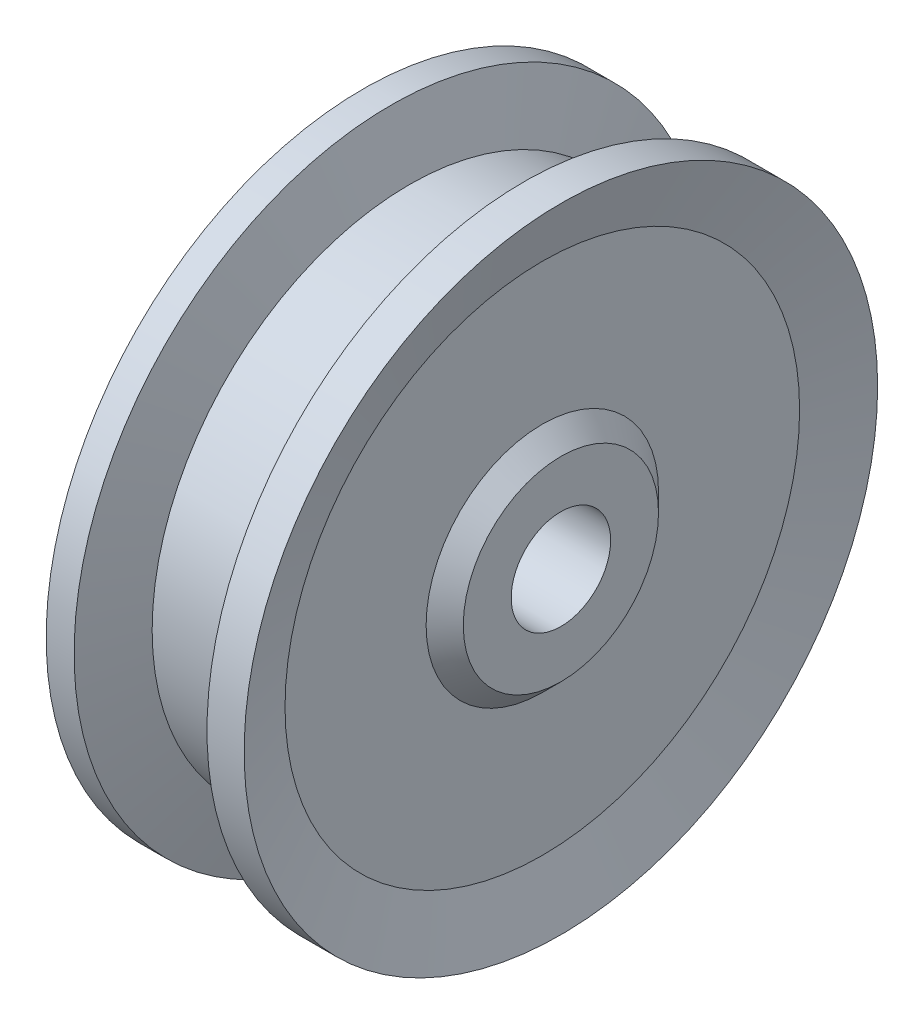
ISO-10303-21;
HEADER;
FILE_DESCRIPTION(('STEP AP214'),'2;1');
FILE_NAME('part.step','',(''),(''),'','','');
FILE_SCHEMA(('AUTOMOTIVE_DESIGN { 1 0 10303 214 1 1 1 1 }'));
ENDSEC;
DATA;
#1=APPLICATION_CONTEXT('core data for automotive mechanical design processes');
#2=APPLICATION_PROTOCOL_DEFINITION('international standard','automotive_design',2000,#1);
#3=PRODUCT_CONTEXT('',#1,'mechanical');
#4=PRODUCT('Part','Part','',(#3));
#5=PRODUCT_RELATED_PRODUCT_CATEGORY('part','',(#4));
#6=PRODUCT_DEFINITION_FORMATION('','',#4);
#7=PRODUCT_DEFINITION_CONTEXT('part definition',#1,'design');
#8=PRODUCT_DEFINITION('design','',#6,#7);
#9=PRODUCT_DEFINITION_SHAPE('','',#8);
#10=(LENGTH_UNIT() NAMED_UNIT(*) SI_UNIT(.MILLI.,.METRE.));
#11=(NAMED_UNIT(*) PLANE_ANGLE_UNIT() SI_UNIT($,.RADIAN.));
#12=(NAMED_UNIT(*) SI_UNIT($,.STERADIAN.) SOLID_ANGLE_UNIT());
#13=UNCERTAINTY_MEASURE_WITH_UNIT(LENGTH_MEASURE(1.E-05),#10,'distance_accuracy_value','');
#14=(GEOMETRIC_REPRESENTATION_CONTEXT(3) GLOBAL_UNCERTAINTY_ASSIGNED_CONTEXT((#13)) GLOBAL_UNIT_ASSIGNED_CONTEXT((#10,
#11,#12)) REPRESENTATION_CONTEXT('',''));
#15=CARTESIAN_POINT('',(0.,0.,0.));
#16=DIRECTION('',(0.,0.,1.));
#17=DIRECTION('',(1.,0.,0.));
#18=AXIS2_PLACEMENT_3D('',#15,#16,#17);
#19=CARTESIAN_POINT('',(57.6768489049945,0.,0.));
#20=DIRECTION('',(1.,0.,0.));
#21=DIRECTION('',(0.,0.,-1.));
#22=AXIS2_PLACEMENT_3D('',#19,#20,#21);
#23=CYLINDRICAL_SURFACE('',#22,40.);
#24=CARTESIAN_POINT('',(7.80674745351395,0.,0.));
#25=DIRECTION('',(1.,0.,0.));
#26=DIRECTION('',(0.,0.,-1.));
#27=AXIS2_PLACEMENT_3D('',#24,#25,#26);
#28=CIRCLE('',#27,40.);
#29=CARTESIAN_POINT('',(7.80674745351395,0.,-40.));
#30=VERTEX_POINT('',#29);
#31=EDGE_CURVE('E10',#30,#30,#28,.T.);
#32=ORIENTED_EDGE('',*,*,#31,.T.);
#33=EDGE_LOOP('',(#32));
#34=FACE_BOUND('',#33,.T.);
#35=CARTESIAN_POINT('',(12.5,0.,0.));
#36=DIRECTION('',(1.,0.,0.));
#37=DIRECTION('',(0.,0.,-1.));
#38=AXIS2_PLACEMENT_3D('',#35,#36,#37);
#39=CIRCLE('',#38,40.);
#40=CARTESIAN_POINT('',(12.5,0.,-40.));
#41=VERTEX_POINT('',#40);
#42=EDGE_CURVE('E76',#41,#41,#39,.T.);
#43=ORIENTED_EDGE('',*,*,#42,.F.);
#44=EDGE_LOOP('',(#43));
#45=FACE_BOUND('',#44,.T.);
#46=ADVANCED_FACE('F30',(#34,#45),#23,.T.);
#47=CARTESIAN_POINT('',(7.80674745351395,0.,0.));
#48=DIRECTION('',(1.,0.,0.));
#49=DIRECTION('',(0.,0.,-1.));
#50=AXIS2_PLACEMENT_3D('',#47,#48,#49);
#51=CONICAL_SURFACE('',#50,40.,1.26791145841993);
#52=CARTESIAN_POINT('',(5.46012118027092,0.,0.));
#53=DIRECTION('',(1.,0.,0.));
#54=DIRECTION('',(0.,0.,-1.));
#55=AXIS2_PLACEMENT_3D('',#52,#53,#54);
#56=CIRCLE('',#55,32.4907959256223);
#57=CARTESIAN_POINT('',(5.46012118027092,0.,-32.4907959256223));
#58=VERTEX_POINT('',#57);
#59=EDGE_CURVE('E36',#58,#58,#56,.T.);
#60=ORIENTED_EDGE('',*,*,#59,.T.);
#61=EDGE_LOOP('',(#60));
#62=FACE_BOUND('',#61,.T.);
#63=ORIENTED_EDGE('',*,*,#31,.F.);
#64=EDGE_LOOP('',(#63));
#65=FACE_BOUND('',#64,.T.);
#66=ADVANCED_FACE('F84',(#62,#65),#51,.T.);
#67=CARTESIAN_POINT('',(57.6768489049945,0.,0.));
#68=DIRECTION('',(1.,0.,0.));
#69=DIRECTION('',(0.,0.,-1.));
#70=AXIS2_PLACEMENT_3D('',#67,#68,#69);
#71=CYLINDRICAL_SURFACE('',#70,32.4907959256223);
#72=CARTESIAN_POINT('',(-6.62706566239128,0.,0.));
#73=DIRECTION('',(1.,0.,0.));
#74=DIRECTION('',(0.,0.,-1.));
#75=AXIS2_PLACEMENT_3D('',#72,#73,#74);
#76=CIRCLE('',#75,32.4907959256223);
#77=CARTESIAN_POINT('',(-6.62706566239128,0.,-32.4907959256223));
#78=VERTEX_POINT('',#77);
#79=EDGE_CURVE('E40',#78,#78,#76,.T.);
#80=ORIENTED_EDGE('',*,*,#79,.T.);
#81=EDGE_LOOP('',(#80));
#82=FACE_BOUND('',#81,.T.);
#83=ORIENTED_EDGE('',*,*,#59,.F.);
#84=EDGE_LOOP('',(#83));
#85=FACE_BOUND('',#84,.T.);
#86=ADVANCED_FACE('F88',(#82,#85),#71,.T.);
#87=CARTESIAN_POINT('',(-6.62706566239128,0.,0.));
#88=DIRECTION('',(-1.,0.,0.));
#89=DIRECTION('',(0.,0.,1.));
#90=AXIS2_PLACEMENT_3D('',#87,#88,#89);
#91=CONICAL_SURFACE('',#90,32.4907959256223,1.26791145841992);
#92=CARTESIAN_POINT('',(-8.97369193563433,0.,0.));
#93=DIRECTION('',(1.,0.,0.));
#94=DIRECTION('',(0.,0.,-1.));
#95=AXIS2_PLACEMENT_3D('',#92,#93,#94);
#96=CIRCLE('',#95,40.);
#97=CARTESIAN_POINT('',(-8.97369193563433,0.,-40.));
#98=VERTEX_POINT('',#97);
#99=EDGE_CURVE('E44',#98,#98,#96,.T.);
#100=ORIENTED_EDGE('',*,*,#99,.T.);
#101=EDGE_LOOP('',(#100));
#102=FACE_BOUND('',#101,.T.);
#103=ORIENTED_EDGE('',*,*,#79,.F.);
#104=EDGE_LOOP('',(#103));
#105=FACE_BOUND('',#104,.T.);
#106=ADVANCED_FACE('F92',(#102,#105),#91,.T.);
#107=CARTESIAN_POINT('',(57.6768489049945,0.,0.));
#108=DIRECTION('',(1.,0.,0.));
#109=DIRECTION('',(0.,0.,-1.));
#110=AXIS2_PLACEMENT_3D('',#107,#108,#109);
#111=CYLINDRICAL_SURFACE('',#110,40.);
#112=CARTESIAN_POINT('',(-12.5,0.,0.));
#113=DIRECTION('',(1.,0.,0.));
#114=DIRECTION('',(0.,0.,-1.));
#115=AXIS2_PLACEMENT_3D('',#112,#113,#114);
#116=CIRCLE('',#115,40.);
#117=CARTESIAN_POINT('',(-12.5,0.,-40.));
#118=VERTEX_POINT('',#117);
#119=EDGE_CURVE('E49',#118,#118,#116,.T.);
#120=ORIENTED_EDGE('',*,*,#119,.T.);
#121=EDGE_LOOP('',(#120));
#122=FACE_BOUND('',#121,.T.);
#123=ORIENTED_EDGE('',*,*,#99,.F.);
#124=EDGE_LOOP('',(#123));
#125=FACE_BOUND('',#124,.T.);
#126=ADVANCED_FACE('F99',(#122,#125),#111,.T.);
#127=CARTESIAN_POINT('',(-12.5,0.,0.));
#128=DIRECTION('',(-1.,0.,0.));
#129=DIRECTION('',(0.,0.,1.));
#130=AXIS2_PLACEMENT_3D('',#127,#128,#129);
#131=CONICAL_SURFACE('',#130,40.,1.26791145841992);
#132=CARTESIAN_POINT('',(-10.153373726757,0.,0.));
#133=DIRECTION('',(1.,0.,0.));
#134=DIRECTION('',(0.,0.,-1.));
#135=AXIS2_PLACEMENT_3D('',#132,#133,#134);
#136=CIRCLE('',#135,32.4907959256223);
#137=CARTESIAN_POINT('',(-10.153373726757,0.,-32.4907959256223));
#138=VERTEX_POINT('',#137);
#139=EDGE_CURVE('E52',#138,#138,#136,.T.);
#140=ORIENTED_EDGE('',*,*,#139,.T.);
#141=EDGE_LOOP('',(#140));
#142=FACE_BOUND('',#141,.T.);
#143=ORIENTED_EDGE('',*,*,#119,.F.);
#144=EDGE_LOOP('',(#143));
#145=FACE_BOUND('',#144,.T.);
#146=ADVANCED_FACE('F103',(#142,#145),#131,.F.);
#147=CARTESIAN_POINT('',(-10.153373726757,32.4907959256223,0.));
#148=DIRECTION('',(-1.,0.,0.));
#149=DIRECTION('',(0.,0.,1.));
#150=AXIS2_PLACEMENT_3D('',#147,#148,#149);
#151=PLANE('',#150);
#152=CARTESIAN_POINT('',(-10.153373726757,0.,0.));
#153=DIRECTION('',(1.,0.,0.));
#154=DIRECTION('',(0.,0.,-1.));
#155=AXIS2_PLACEMENT_3D('',#152,#153,#154);
#156=CIRCLE('',#155,14.674038193391);
#157=CARTESIAN_POINT('',(-10.153373726757,0.,-14.674038193391));
#158=VERTEX_POINT('',#157);
#159=EDGE_CURVE('E55',#158,#158,#156,.T.);
#160=ORIENTED_EDGE('',*,*,#159,.T.);
#161=EDGE_LOOP('',(#160));
#162=FACE_BOUND('',#161,.T.);
#163=ORIENTED_EDGE('',*,*,#139,.F.);
#164=EDGE_LOOP('',(#163));
#165=FACE_BOUND('',#164,.T.);
#166=ADVANCED_FACE('F107',(#162,#165),#151,.T.);
#167=CARTESIAN_POINT('',(-10.153373726757,0.,0.));
#168=DIRECTION('',(1.,0.,0.));
#169=DIRECTION('',(0.,0.,-1.));
#170=AXIS2_PLACEMENT_3D('',#167,#168,#169);
#171=CONICAL_SURFACE('',#170,14.674038193391,0.78539816339745);
#172=CARTESIAN_POINT('',(-12.5,0.,0.));
#173=DIRECTION('',(1.,0.,0.));
#174=DIRECTION('',(0.,0.,-1.));
#175=AXIS2_PLACEMENT_3D('',#172,#173,#174);
#176=CIRCLE('',#175,12.327411920148);
#177=CARTESIAN_POINT('',(-12.5,0.,-12.327411920148));
#178=VERTEX_POINT('',#177);
#179=EDGE_CURVE('E58',#178,#178,#176,.T.);
#180=ORIENTED_EDGE('',*,*,#179,.T.);
#181=EDGE_LOOP('',(#180));
#182=FACE_BOUND('',#181,.T.);
#183=ORIENTED_EDGE('',*,*,#159,.F.);
#184=EDGE_LOOP('',(#183));
#185=FACE_BOUND('',#184,.T.);
#186=ADVANCED_FACE('F111',(#182,#185),#171,.T.);
#187=CARTESIAN_POINT('',(-12.5,12.327411920148,0.));
#188=DIRECTION('',(-1.,0.,0.));
#189=DIRECTION('',(0.,0.,1.));
#190=AXIS2_PLACEMENT_3D('',#187,#188,#189);
#191=PLANE('',#190);
#192=CARTESIAN_POINT('',(-12.5,0.,0.));
#193=DIRECTION('',(1.,0.,0.));
#194=DIRECTION('',(0.,0.,-1.));
#195=AXIS2_PLACEMENT_3D('',#192,#193,#194);
#196=CIRCLE('',#195,6.28081453375527);
#197=CARTESIAN_POINT('',(-12.5,0.,-6.28081453375527));
#198=VERTEX_POINT('',#197);
#199=EDGE_CURVE('E61',#198,#198,#196,.T.);
#200=ORIENTED_EDGE('',*,*,#199,.T.);
#201=EDGE_LOOP('',(#200));
#202=FACE_BOUND('',#201,.T.);
#203=ORIENTED_EDGE('',*,*,#179,.F.);
#204=EDGE_LOOP('',(#203));
#205=FACE_BOUND('',#204,.T.);
#206=ADVANCED_FACE('F115',(#202,#205),#191,.T.);
#207=CARTESIAN_POINT('',(57.6768489049945,0.,0.));
#208=DIRECTION('',(1.,0.,0.));
#209=DIRECTION('',(0.,0.,-1.));
#210=AXIS2_PLACEMENT_3D('',#207,#208,#209);
#211=CYLINDRICAL_SURFACE('',#210,6.28081453375527);
#212=CARTESIAN_POINT('',(12.5,0.,0.));
#213=DIRECTION('',(1.,0.,0.));
#214=DIRECTION('',(0.,0.,-1.));
#215=AXIS2_PLACEMENT_3D('',#212,#213,#214);
#216=CIRCLE('',#215,6.28081453375527);
#217=CARTESIAN_POINT('',(12.5,0.,-6.28081453375527));
#218=VERTEX_POINT('',#217);
#219=EDGE_CURVE('E64',#218,#218,#216,.T.);
#220=ORIENTED_EDGE('',*,*,#219,.T.);
#221=EDGE_LOOP('',(#220));
#222=FACE_BOUND('',#221,.T.);
#223=ORIENTED_EDGE('',*,*,#199,.F.);
#224=EDGE_LOOP('',(#223));
#225=FACE_BOUND('',#224,.T.);
#226=ADVANCED_FACE('F119',(#222,#225),#211,.F.);
#227=CARTESIAN_POINT('',(12.5,6.28081453375527,0.));
#228=DIRECTION('',(1.,0.,0.));
#229=DIRECTION('',(0.,0.,-1.));
#230=AXIS2_PLACEMENT_3D('',#227,#228,#229);
#231=PLANE('',#230);
#232=CARTESIAN_POINT('',(12.5,0.,0.));
#233=DIRECTION('',(1.,0.,0.));
#234=DIRECTION('',(0.,0.,-1.));
#235=AXIS2_PLACEMENT_3D('',#232,#233,#234);
#236=CIRCLE('',#235,12.327411920148);
#237=CARTESIAN_POINT('',(12.5,0.,-12.327411920148));
#238=VERTEX_POINT('',#237);
#239=EDGE_CURVE('E67',#238,#238,#236,.T.);
#240=ORIENTED_EDGE('',*,*,#239,.T.);
#241=EDGE_LOOP('',(#240));
#242=FACE_BOUND('',#241,.T.);
#243=ORIENTED_EDGE('',*,*,#219,.F.);
#244=EDGE_LOOP('',(#243));
#245=FACE_BOUND('',#244,.T.);
#246=ADVANCED_FACE('F123',(#242,#245),#231,.T.);
#247=CARTESIAN_POINT('',(12.5,0.,0.));
#248=DIRECTION('',(-1.,0.,0.));
#249=DIRECTION('',(0.,0.,1.));
#250=AXIS2_PLACEMENT_3D('',#247,#248,#249);
#251=CONICAL_SURFACE('',#250,12.327411920148,0.785398163397447);
#252=CARTESIAN_POINT('',(10.153373726757,0.,0.));
#253=DIRECTION('',(1.,0.,0.));
#254=DIRECTION('',(0.,0.,-1.));
#255=AXIS2_PLACEMENT_3D('',#252,#253,#254);
#256=CIRCLE('',#255,14.674038193391);
#257=CARTESIAN_POINT('',(10.153373726757,0.,-14.674038193391));
#258=VERTEX_POINT('',#257);
#259=EDGE_CURVE('E70',#258,#258,#256,.T.);
#260=ORIENTED_EDGE('',*,*,#259,.T.);
#261=EDGE_LOOP('',(#260));
#262=FACE_BOUND('',#261,.T.);
#263=ORIENTED_EDGE('',*,*,#239,.F.);
#264=EDGE_LOOP('',(#263));
#265=FACE_BOUND('',#264,.T.);
#266=ADVANCED_FACE('F127',(#262,#265),#251,.T.);
#267=CARTESIAN_POINT('',(10.153373726757,14.674038193391,0.));
#268=DIRECTION('',(1.,0.,0.));
#269=DIRECTION('',(0.,0.,-1.));
#270=AXIS2_PLACEMENT_3D('',#267,#268,#269);
#271=PLANE('',#270);
#272=CARTESIAN_POINT('',(10.153373726757,0.,0.));
#273=DIRECTION('',(1.,0.,0.));
#274=DIRECTION('',(0.,0.,-1.));
#275=AXIS2_PLACEMENT_3D('',#272,#273,#274);
#276=CIRCLE('',#275,32.4907959256223);
#277=CARTESIAN_POINT('',(10.153373726757,0.,-32.4907959256223));
#278=VERTEX_POINT('',#277);
#279=EDGE_CURVE('E73',#278,#278,#276,.T.);
#280=ORIENTED_EDGE('',*,*,#279,.T.);
#281=EDGE_LOOP('',(#280));
#282=FACE_BOUND('',#281,.T.);
#283=ORIENTED_EDGE('',*,*,#259,.F.);
#284=EDGE_LOOP('',(#283));
#285=FACE_BOUND('',#284,.T.);
#286=ADVANCED_FACE('F131',(#282,#285),#271,.T.);
#287=CARTESIAN_POINT('',(10.153373726757,0.,0.));
#288=DIRECTION('',(1.,0.,0.));
#289=DIRECTION('',(0.,0.,-1.));
#290=AXIS2_PLACEMENT_3D('',#287,#288,#289);
#291=CONICAL_SURFACE('',#290,32.4907959256223,1.26791145841993);
#292=ORIENTED_EDGE('',*,*,#42,.T.);
#293=EDGE_LOOP('',(#292));
#294=FACE_BOUND('',#293,.T.);
#295=ORIENTED_EDGE('',*,*,#279,.F.);
#296=EDGE_LOOP('',(#295));
#297=FACE_BOUND('',#296,.T.);
#298=ADVANCED_FACE('F80',(#294,#297),#291,.F.);
#299=CLOSED_SHELL('',(#46,#66,#86,#106,#126,#146,#166,#186,#206,#226,#246,#266,#286,#298));
#300=MANIFOLD_SOLID_BREP('B2',#299);
#301=ADVANCED_BREP_SHAPE_REPRESENTATION('',(#18,#300),#14);
#302=SHAPE_DEFINITION_REPRESENTATION(#9,#301);
ENDSEC;
END-ISO-10303-21;
